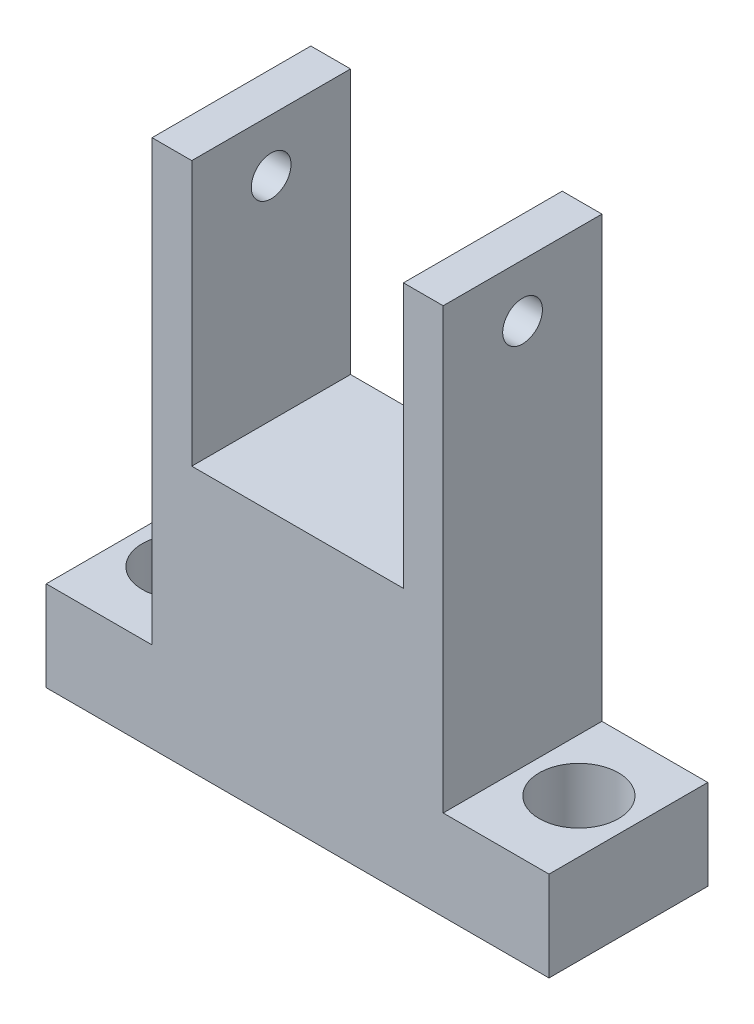
ISO-10303-21;
HEADER;
FILE_DESCRIPTION(('STEP AP214'),'2;1');
FILE_NAME('part.step','',(''),(''),'','','');
FILE_SCHEMA(('AUTOMOTIVE_DESIGN { 1 0 10303 214 1 1 1 1 }'));
ENDSEC;
DATA;
#1=APPLICATION_CONTEXT('core data for automotive mechanical design processes');
#2=APPLICATION_PROTOCOL_DEFINITION('international standard','automotive_design',2000,#1);
#3=PRODUCT_CONTEXT('',#1,'mechanical');
#4=PRODUCT('Part','Part','',(#3));
#5=PRODUCT_RELATED_PRODUCT_CATEGORY('part','',(#4));
#6=PRODUCT_DEFINITION_FORMATION('','',#4);
#7=PRODUCT_DEFINITION_CONTEXT('part definition',#1,'design');
#8=PRODUCT_DEFINITION('design','',#6,#7);
#9=PRODUCT_DEFINITION_SHAPE('','',#8);
#10=(LENGTH_UNIT() NAMED_UNIT(*) SI_UNIT(.MILLI.,.METRE.));
#11=(NAMED_UNIT(*) PLANE_ANGLE_UNIT() SI_UNIT($,.RADIAN.));
#12=(NAMED_UNIT(*) SI_UNIT($,.STERADIAN.) SOLID_ANGLE_UNIT());
#13=UNCERTAINTY_MEASURE_WITH_UNIT(LENGTH_MEASURE(1.E-05),#10,'distance_accuracy_value','');
#14=(GEOMETRIC_REPRESENTATION_CONTEXT(3) GLOBAL_UNCERTAINTY_ASSIGNED_CONTEXT((#13)) GLOBAL_UNIT_ASSIGNED_CONTEXT((#10,
#11,#12)) REPRESENTATION_CONTEXT('',''));
#15=CARTESIAN_POINT('',(0.,0.,0.));
#16=DIRECTION('',(0.,0.,1.));
#17=DIRECTION('',(1.,0.,0.));
#18=AXIS2_PLACEMENT_3D('',#15,#16,#17);
#19=CARTESIAN_POINT('',(0.,3.4,0.));
#20=DIRECTION('',(0.,1.,0.));
#21=DIRECTION('',(0.,0.,1.));
#22=AXIS2_PLACEMENT_3D('',#19,#20,#21);
#23=PLANE('',#22);
#24=CARTESIAN_POINT('',(-7.5,3.4,-0.128979829095297));
#25=DIRECTION('',(0.,1.,0.));
#26=DIRECTION('',(0.,0.,1.));
#27=AXIS2_PLACEMENT_3D('',#24,#25,#26);
#28=CIRCLE('',#27,1.5);
#29=CARTESIAN_POINT('',(-7.5,3.4,1.3710201709047));
#30=VERTEX_POINT('',#29);
#31=EDGE_CURVE('E177',#30,#30,#28,.T.);
#32=ORIENTED_EDGE('',*,*,#31,.F.);
#33=EDGE_LOOP('',(#32));
#34=FACE_BOUND('',#33,.T.);
#35=DIRECTION('',(1.,0.,0.));
#36=VECTOR('',#35,1.);
#37=CARTESIAN_POINT('',(0.,3.4,3.));
#38=LINE('',#37,#36);
#39=CARTESIAN_POINT('',(-9.5,3.4,3.));
#40=VERTEX_POINT('',#39);
#41=CARTESIAN_POINT('',(-5.5,3.4,3.));
#42=VERTEX_POINT('',#41);
#43=EDGE_CURVE('E185',#40,#42,#38,.T.);
#44=ORIENTED_EDGE('',*,*,#43,.T.);
#45=DIRECTION('',(0.,0.,-1.));
#46=VECTOR('',#45,1.);
#47=CARTESIAN_POINT('',(-5.5,3.4,0.));
#48=LINE('',#47,#46);
#49=CARTESIAN_POINT('',(-5.5,3.4,-3.));
#50=VERTEX_POINT('',#49);
#51=EDGE_CURVE('E174',#42,#50,#48,.T.);
#52=ORIENTED_EDGE('',*,*,#51,.T.);
#53=DIRECTION('',(1.,0.,0.));
#54=VECTOR('',#53,1.);
#55=CARTESIAN_POINT('',(0.,3.4,-3.));
#56=LINE('',#55,#54);
#57=CARTESIAN_POINT('',(-9.5,3.4,-3.));
#58=VERTEX_POINT('',#57);
#59=EDGE_CURVE('E191',#58,#50,#56,.T.);
#60=ORIENTED_EDGE('',*,*,#59,.F.);
#61=DIRECTION('',(0.,0.,1.));
#62=VECTOR('',#61,1.);
#63=CARTESIAN_POINT('',(-9.5,3.4,0.));
#64=LINE('',#63,#62);
#65=EDGE_CURVE('E180',#58,#40,#64,.T.);
#66=ORIENTED_EDGE('',*,*,#65,.T.);
#67=EDGE_LOOP('',(#44,#52,#60,#66));
#68=FACE_BOUND('',#67,.T.);
#69=ADVANCED_FACE('F37',(#34,#68),#23,.T.);
#70=CARTESIAN_POINT('',(-9.5,3.4,0.));
#71=DIRECTION('',(1.,0.,0.));
#72=DIRECTION('',(0.,0.,-1.));
#73=AXIS2_PLACEMENT_3D('',#70,#71,#72);
#74=PLANE('',#73);
#75=DIRECTION('',(0.,0.,1.));
#76=VECTOR('',#75,1.);
#77=CARTESIAN_POINT('',(-9.5,0.,0.));
#78=LINE('',#77,#76);
#79=CARTESIAN_POINT('',(-9.5,0.,-3.));
#80=VERTEX_POINT('',#79);
#81=CARTESIAN_POINT('',(-9.5,0.,3.));
#82=VERTEX_POINT('',#81);
#83=EDGE_CURVE('E200',#80,#82,#78,.T.);
#84=ORIENTED_EDGE('',*,*,#83,.T.);
#85=DIRECTION('',(0.,-1.,0.));
#86=VECTOR('',#85,1.);
#87=CARTESIAN_POINT('',(-9.5,3.4,3.));
#88=LINE('',#87,#86);
#89=EDGE_CURVE('E11',#40,#82,#88,.T.);
#90=ORIENTED_EDGE('',*,*,#89,.F.);
#91=ORIENTED_EDGE('',*,*,#65,.F.);
#92=DIRECTION('',(0.,-1.,0.));
#93=VECTOR('',#92,1.);
#94=CARTESIAN_POINT('',(-9.5,3.4,-3.));
#95=LINE('',#94,#93);
#96=EDGE_CURVE('E197',#58,#80,#95,.T.);
#97=ORIENTED_EDGE('',*,*,#96,.T.);
#98=EDGE_LOOP('',(#84,#90,#91,#97));
#99=FACE_BOUND('',#98,.T.);
#100=ADVANCED_FACE('F278',(#99),#74,.F.);
#101=CARTESIAN_POINT('',(0.,3.4,3.));
#102=DIRECTION('',(0.,0.,-1.));
#103=DIRECTION('',(-1.,0.,0.));
#104=AXIS2_PLACEMENT_3D('',#101,#102,#103);
#105=PLANE('',#104);
#106=DIRECTION('',(1.,0.,0.));
#107=VECTOR('',#106,1.);
#108=CARTESIAN_POINT('',(0.,0.,3.));
#109=LINE('',#108,#107);
#110=CARTESIAN_POINT('',(9.5,0.,3.));
#111=VERTEX_POINT('',#110);
#112=EDGE_CURVE('E203',#82,#111,#109,.T.);
#113=ORIENTED_EDGE('',*,*,#112,.T.);
#114=DIRECTION('',(0.,-1.,0.));
#115=VECTOR('',#114,1.);
#116=CARTESIAN_POINT('',(9.5,3.4,3.));
#117=LINE('',#116,#115);
#118=CARTESIAN_POINT('',(9.5,3.4,3.));
#119=VERTEX_POINT('',#118);
#120=EDGE_CURVE('E46',#119,#111,#117,.T.);
#121=ORIENTED_EDGE('',*,*,#120,.F.);
#122=CARTESIAN_POINT('',(5.5,3.4,3.));
#123=VERTEX_POINT('',#122);
#124=EDGE_CURVE('E184',#123,#119,#38,.T.);
#125=ORIENTED_EDGE('',*,*,#124,.F.);
#126=DIRECTION('',(0.,-1.,0.));
#127=VECTOR('',#126,1.);
#128=CARTESIAN_POINT('',(5.5,20.,3.));
#129=LINE('',#128,#127);
#130=CARTESIAN_POINT('',(5.5,20.,3.));
#131=VERTEX_POINT('',#130);
#132=EDGE_CURVE('E152',#131,#123,#129,.T.);
#133=ORIENTED_EDGE('',*,*,#132,.F.);
#134=DIRECTION('',(1.,0.,0.));
#135=VECTOR('',#134,1.);
#136=CARTESIAN_POINT('',(0.,20.,3.));
#137=LINE('',#136,#135);
#138=CARTESIAN_POINT('',(4.,20.,3.));
#139=VERTEX_POINT('',#138);
#140=EDGE_CURVE('E244',#139,#131,#137,.T.);
#141=ORIENTED_EDGE('',*,*,#140,.F.);
#142=DIRECTION('',(0.,-1.,0.));
#143=VECTOR('',#142,1.);
#144=CARTESIAN_POINT('',(4.,20.,3.));
#145=LINE('',#144,#143);
#146=CARTESIAN_POINT('',(4.,10.,3.));
#147=VERTEX_POINT('',#146);
#148=EDGE_CURVE('E148',#139,#147,#145,.T.);
#149=ORIENTED_EDGE('',*,*,#148,.T.);
#150=DIRECTION('',(1.,0.,0.));
#151=VECTOR('',#150,1.);
#152=CARTESIAN_POINT('',(0.,10.,3.));
#153=LINE('',#152,#151);
#154=CARTESIAN_POINT('',(-4.,10.,3.));
#155=VERTEX_POINT('',#154);
#156=EDGE_CURVE('E53',#155,#147,#153,.T.);
#157=ORIENTED_EDGE('',*,*,#156,.F.);
#158=DIRECTION('',(0.,-1.,0.));
#159=VECTOR('',#158,1.);
#160=CARTESIAN_POINT('',(-4.,20.,3.));
#161=LINE('',#160,#159);
#162=CARTESIAN_POINT('',(-4.,20.,3.));
#163=VERTEX_POINT('',#162);
#164=EDGE_CURVE('E164',#163,#155,#161,.T.);
#165=ORIENTED_EDGE('',*,*,#164,.F.);
#166=DIRECTION('',(1.,0.,0.));
#167=VECTOR('',#166,1.);
#168=CARTESIAN_POINT('',(0.,20.,3.));
#169=LINE('',#168,#167);
#170=CARTESIAN_POINT('',(-5.5,20.,3.));
#171=VERTEX_POINT('',#170);
#172=EDGE_CURVE('E162',#171,#163,#169,.T.);
#173=ORIENTED_EDGE('',*,*,#172,.F.);
#174=DIRECTION('',(0.,-1.,0.));
#175=VECTOR('',#174,1.);
#176=CARTESIAN_POINT('',(-5.5,20.,3.));
#177=LINE('',#176,#175);
#178=EDGE_CURVE('E167',#171,#42,#177,.T.);
#179=ORIENTED_EDGE('',*,*,#178,.T.);
#180=ORIENTED_EDGE('',*,*,#43,.F.);
#181=ORIENTED_EDGE('',*,*,#89,.T.);
#182=EDGE_LOOP('',(#113,#121,#125,#133,#141,#149,#157,#165,#173,#179,#180,#181));
#183=FACE_BOUND('',#182,.T.);
#184=ADVANCED_FACE('F233',(#183),#105,.F.);
#185=CARTESIAN_POINT('',(9.5,3.4,0.));
#186=DIRECTION('',(1.,0.,0.));
#187=DIRECTION('',(0.,0.,-1.));
#188=AXIS2_PLACEMENT_3D('',#185,#186,#187);
#189=PLANE('',#188);
#190=DIRECTION('',(0.,0.,1.));
#191=VECTOR('',#190,1.);
#192=CARTESIAN_POINT('',(9.5,0.,0.));
#193=LINE('',#192,#191);
#194=CARTESIAN_POINT('',(9.5,0.,-3.));
#195=VERTEX_POINT('',#194);
#196=EDGE_CURVE('E205',#195,#111,#193,.T.);
#197=ORIENTED_EDGE('',*,*,#196,.F.);
#198=DIRECTION('',(0.,-1.,0.));
#199=VECTOR('',#198,1.);
#200=CARTESIAN_POINT('',(9.5,3.4,-3.));
#201=LINE('',#200,#199);
#202=CARTESIAN_POINT('',(9.5,3.4,-3.));
#203=VERTEX_POINT('',#202);
#204=EDGE_CURVE('E213',#203,#195,#201,.T.);
#205=ORIENTED_EDGE('',*,*,#204,.F.);
#206=DIRECTION('',(0.,0.,1.));
#207=VECTOR('',#206,1.);
#208=CARTESIAN_POINT('',(9.5,3.4,0.));
#209=LINE('',#208,#207);
#210=EDGE_CURVE('E187',#203,#119,#209,.T.);
#211=ORIENTED_EDGE('',*,*,#210,.T.);
#212=ORIENTED_EDGE('',*,*,#120,.T.);
#213=EDGE_LOOP('',(#197,#205,#211,#212));
#214=FACE_BOUND('',#213,.T.);
#215=ADVANCED_FACE('F219',(#214),#189,.T.);
#216=CARTESIAN_POINT('',(0.,3.4,-3.));
#217=DIRECTION('',(0.,0.,-1.));
#218=DIRECTION('',(-1.,0.,0.));
#219=AXIS2_PLACEMENT_3D('',#216,#217,#218);
#220=PLANE('',#219);
#221=ORIENTED_EDGE('',*,*,#204,.T.);
#222=DIRECTION('',(1.,0.,0.));
#223=VECTOR('',#222,1.);
#224=CARTESIAN_POINT('',(0.,0.,-3.));
#225=LINE('',#224,#223);
#226=EDGE_CURVE('E208',#80,#195,#225,.T.);
#227=ORIENTED_EDGE('',*,*,#226,.F.);
#228=ORIENTED_EDGE('',*,*,#96,.F.);
#229=ORIENTED_EDGE('',*,*,#59,.T.);
#230=DIRECTION('',(0.,-1.,0.));
#231=VECTOR('',#230,1.);
#232=CARTESIAN_POINT('',(-5.5,20.,-3.));
#233=LINE('',#232,#231);
#234=CARTESIAN_POINT('',(-5.5,20.,-3.));
#235=VERTEX_POINT('',#234);
#236=EDGE_CURVE('E170',#235,#50,#233,.T.);
#237=ORIENTED_EDGE('',*,*,#236,.F.);
#238=DIRECTION('',(1.,0.,0.));
#239=VECTOR('',#238,1.);
#240=CARTESIAN_POINT('',(0.,20.,-3.));
#241=LINE('',#240,#239);
#242=CARTESIAN_POINT('',(-4.,20.,-3.));
#243=VERTEX_POINT('',#242);
#244=EDGE_CURVE('E158',#235,#243,#241,.T.);
#245=ORIENTED_EDGE('',*,*,#244,.T.);
#246=DIRECTION('',(0.,-1.,0.));
#247=VECTOR('',#246,1.);
#248=CARTESIAN_POINT('',(-4.,20.,-3.));
#249=LINE('',#248,#247);
#250=CARTESIAN_POINT('',(-4.,10.,-3.));
#251=VERTEX_POINT('',#250);
#252=EDGE_CURVE('E142',#243,#251,#249,.T.);
#253=ORIENTED_EDGE('',*,*,#252,.T.);
#254=DIRECTION('',(1.,0.,0.));
#255=VECTOR('',#254,1.);
#256=CARTESIAN_POINT('',(0.,10.,-3.));
#257=LINE('',#256,#255);
#258=CARTESIAN_POINT('',(4.,10.,-3.));
#259=VERTEX_POINT('',#258);
#260=EDGE_CURVE('E127',#251,#259,#257,.T.);
#261=ORIENTED_EDGE('',*,*,#260,.T.);
#262=DIRECTION('',(0.,-1.,0.));
#263=VECTOR('',#262,1.);
#264=CARTESIAN_POINT('',(4.,20.,-3.));
#265=LINE('',#264,#263);
#266=CARTESIAN_POINT('',(4.,20.,-3.));
#267=VERTEX_POINT('',#266);
#268=EDGE_CURVE('E139',#267,#259,#265,.T.);
#269=ORIENTED_EDGE('',*,*,#268,.F.);
#270=DIRECTION('',(1.,0.,0.));
#271=VECTOR('',#270,1.);
#272=CARTESIAN_POINT('',(0.,20.,-3.));
#273=LINE('',#272,#271);
#274=CARTESIAN_POINT('',(5.5,20.,-3.));
#275=VERTEX_POINT('',#274);
#276=EDGE_CURVE('E247',#267,#275,#273,.T.);
#277=ORIENTED_EDGE('',*,*,#276,.T.);
#278=DIRECTION('',(0.,-1.,0.));
#279=VECTOR('',#278,1.);
#280=CARTESIAN_POINT('',(5.5,20.,-3.));
#281=LINE('',#280,#279);
#282=CARTESIAN_POINT('',(5.5,3.4,-3.));
#283=VERTEX_POINT('',#282);
#284=EDGE_CURVE('E240',#275,#283,#281,.T.);
#285=ORIENTED_EDGE('',*,*,#284,.T.);
#286=EDGE_CURVE('E190',#283,#203,#56,.T.);
#287=ORIENTED_EDGE('',*,*,#286,.T.);
#288=EDGE_LOOP('',(#221,#227,#228,#229,#237,#245,#253,#261,#269,#277,#285,#287));
#289=FACE_BOUND('',#288,.T.);
#290=ADVANCED_FACE('F137',(#289),#220,.T.);
#291=CARTESIAN_POINT('',(-7.5,3.4,-0.128979829095297));
#292=DIRECTION('',(0.,-1.,0.));
#293=DIRECTION('',(0.,0.,-1.));
#294=AXIS2_PLACEMENT_3D('',#291,#292,#293);
#295=CYLINDRICAL_SURFACE('',#294,1.5);
#296=ORIENTED_EDGE('',*,*,#31,.T.);
#297=EDGE_LOOP('',(#296));
#298=FACE_BOUND('',#297,.T.);
#299=CARTESIAN_POINT('',(-7.5,0.,-0.128979829095297));
#300=DIRECTION('',(0.,1.,0.));
#301=DIRECTION('',(0.,0.,1.));
#302=AXIS2_PLACEMENT_3D('',#299,#300,#301);
#303=CIRCLE('',#302,1.5);
#304=CARTESIAN_POINT('',(-7.5,0.,1.3710201709047));
#305=VERTEX_POINT('',#304);
#306=EDGE_CURVE('E176',#305,#305,#303,.T.);
#307=ORIENTED_EDGE('',*,*,#306,.F.);
#308=EDGE_LOOP('',(#307));
#309=FACE_BOUND('',#308,.T.);
#310=ADVANCED_FACE('F39',(#298,#309),#295,.F.);
#311=CARTESIAN_POINT('',(7.5,3.4,-0.128979829095297));
#312=DIRECTION('',(0.,-1.,0.));
#313=DIRECTION('',(0.,0.,-1.));
#314=AXIS2_PLACEMENT_3D('',#311,#312,#313);
#315=CYLINDRICAL_SURFACE('',#314,1.5);
#316=CARTESIAN_POINT('',(7.5,3.4,-0.128979829095297));
#317=DIRECTION('',(0.,1.,0.));
#318=DIRECTION('',(0.,0.,1.));
#319=AXIS2_PLACEMENT_3D('',#316,#317,#318);
#320=CIRCLE('',#319,1.5);
#321=CARTESIAN_POINT('',(7.5,3.4,1.3710201709047));
#322=VERTEX_POINT('',#321);
#323=EDGE_CURVE('E194',#322,#322,#320,.F.);
#324=ORIENTED_EDGE('',*,*,#323,.F.);
#325=EDGE_LOOP('',(#324));
#326=FACE_BOUND('',#325,.T.);
#327=CARTESIAN_POINT('',(7.5,0.,-0.128979829095297));
#328=DIRECTION('',(0.,1.,0.));
#329=DIRECTION('',(0.,0.,1.));
#330=AXIS2_PLACEMENT_3D('',#327,#328,#329);
#331=CIRCLE('',#330,1.5);
#332=CARTESIAN_POINT('',(7.5,0.,1.3710201709047));
#333=VERTEX_POINT('',#332);
#334=EDGE_CURVE('E181',#333,#333,#331,.F.);
#335=ORIENTED_EDGE('',*,*,#334,.T.);
#336=EDGE_LOOP('',(#335));
#337=FACE_BOUND('',#336,.T.);
#338=ADVANCED_FACE('F290',(#326,#337),#315,.F.);
#339=DIRECTION('',(0.,0.,-1.));
#340=VECTOR('',#339,1.);
#341=CARTESIAN_POINT('',(5.5,3.4,0.));
#342=LINE('',#341,#340);
#343=EDGE_CURVE('E61',#123,#283,#342,.T.);
#344=ORIENTED_EDGE('',*,*,#343,.F.);
#345=ORIENTED_EDGE('',*,*,#124,.T.);
#346=ORIENTED_EDGE('',*,*,#210,.F.);
#347=ORIENTED_EDGE('',*,*,#286,.F.);
#348=EDGE_LOOP('',(#344,#345,#346,#347));
#349=FACE_BOUND('',#348,.T.);
#350=ORIENTED_EDGE('',*,*,#323,.T.);
#351=EDGE_LOOP('',(#350));
#352=FACE_BOUND('',#351,.T.);
#353=ADVANCED_FACE('F229',(#349,#352),#23,.T.);
#354=CARTESIAN_POINT('',(0.,0.,0.));
#355=DIRECTION('',(0.,1.,0.));
#356=DIRECTION('',(0.,0.,1.));
#357=AXIS2_PLACEMENT_3D('',#354,#355,#356);
#358=PLANE('',#357);
#359=ORIENTED_EDGE('',*,*,#196,.T.);
#360=ORIENTED_EDGE('',*,*,#112,.F.);
#361=ORIENTED_EDGE('',*,*,#83,.F.);
#362=ORIENTED_EDGE('',*,*,#226,.T.);
#363=EDGE_LOOP('',(#359,#360,#361,#362));
#364=FACE_BOUND('',#363,.T.);
#365=ORIENTED_EDGE('',*,*,#334,.F.);
#366=EDGE_LOOP('',(#365));
#367=FACE_BOUND('',#366,.T.);
#368=ORIENTED_EDGE('',*,*,#306,.T.);
#369=EDGE_LOOP('',(#368));
#370=FACE_BOUND('',#369,.T.);
#371=ADVANCED_FACE('F224',(#364,#367,#370),#358,.F.);
#372=CARTESIAN_POINT('',(-4.,20.,0.));
#373=DIRECTION('',(1.,0.,0.));
#374=DIRECTION('',(0.,0.,-1.));
#375=AXIS2_PLACEMENT_3D('',#372,#373,#374);
#376=PLANE('',#375);
#377=DIRECTION('',(0.,0.,1.));
#378=VECTOR('',#377,1.);
#379=CARTESIAN_POINT('',(-4.,10.,0.));
#380=LINE('',#379,#378);
#381=EDGE_CURVE('E143',#251,#155,#380,.T.);
#382=ORIENTED_EDGE('',*,*,#381,.F.);
#383=ORIENTED_EDGE('',*,*,#252,.F.);
#384=DIRECTION('',(0.,0.,1.));
#385=VECTOR('',#384,1.);
#386=CARTESIAN_POINT('',(-4.,20.,0.));
#387=LINE('',#386,#385);
#388=EDGE_CURVE('E150',#243,#163,#387,.T.);
#389=ORIENTED_EDGE('',*,*,#388,.T.);
#390=ORIENTED_EDGE('',*,*,#164,.T.);
#391=EDGE_LOOP('',(#382,#383,#389,#390));
#392=FACE_BOUND('',#391,.T.);
#393=CARTESIAN_POINT('',(-4.,18.,0.));
#394=DIRECTION('',(1.,0.,0.));
#395=DIRECTION('',(0.,0.,-1.));
#396=AXIS2_PLACEMENT_3D('',#393,#394,#395);
#397=CIRCLE('',#396,0.750000000000001);
#398=CARTESIAN_POINT('',(-4.,18.,-0.750000000000001));
#399=VERTEX_POINT('',#398);
#400=EDGE_CURVE('E249',#399,#399,#397,.T.);
#401=ORIENTED_EDGE('',*,*,#400,.F.);
#402=EDGE_LOOP('',(#401));
#403=FACE_BOUND('',#402,.T.);
#404=ADVANCED_FACE('F295',(#392,#403),#376,.T.);
#405=CARTESIAN_POINT('',(-5.5,20.,0.));
#406=DIRECTION('',(1.,0.,0.));
#407=DIRECTION('',(0.,0.,-1.));
#408=AXIS2_PLACEMENT_3D('',#405,#406,#407);
#409=PLANE('',#408);
#410=CARTESIAN_POINT('',(-5.5,18.,0.));
#411=DIRECTION('',(1.,0.,0.));
#412=DIRECTION('',(0.,0.,-1.));
#413=AXIS2_PLACEMENT_3D('',#410,#411,#412);
#414=CIRCLE('',#413,0.750000000000001);
#415=CARTESIAN_POINT('',(-5.5,18.,-0.750000000000001));
#416=VERTEX_POINT('',#415);
#417=EDGE_CURVE('E252',#416,#416,#414,.T.);
#418=ORIENTED_EDGE('',*,*,#417,.T.);
#419=EDGE_LOOP('',(#418));
#420=FACE_BOUND('',#419,.T.);
#421=ORIENTED_EDGE('',*,*,#51,.F.);
#422=ORIENTED_EDGE('',*,*,#178,.F.);
#423=DIRECTION('',(0.,0.,1.));
#424=VECTOR('',#423,1.);
#425=CARTESIAN_POINT('',(-5.5,20.,0.));
#426=LINE('',#425,#424);
#427=EDGE_CURVE('E160',#235,#171,#426,.T.);
#428=ORIENTED_EDGE('',*,*,#427,.F.);
#429=ORIENTED_EDGE('',*,*,#236,.T.);
#430=EDGE_LOOP('',(#421,#422,#428,#429));
#431=FACE_BOUND('',#430,.T.);
#432=ADVANCED_FACE('F355',(#420,#431),#409,.F.);
#433=CARTESIAN_POINT('',(0.,20.,0.));
#434=DIRECTION('',(0.,1.,0.));
#435=DIRECTION('',(0.,0.,1.));
#436=AXIS2_PLACEMENT_3D('',#433,#434,#435);
#437=PLANE('',#436);
#438=ORIENTED_EDGE('',*,*,#388,.F.);
#439=ORIENTED_EDGE('',*,*,#244,.F.);
#440=ORIENTED_EDGE('',*,*,#427,.T.);
#441=ORIENTED_EDGE('',*,*,#172,.T.);
#442=EDGE_LOOP('',(#438,#439,#440,#441));
#443=FACE_BOUND('',#442,.T.);
#444=ADVANCED_FACE('F274',(#443),#437,.T.);
#445=CARTESIAN_POINT('',(4.,20.,0.));
#446=DIRECTION('',(1.,0.,0.));
#447=DIRECTION('',(0.,0.,-1.));
#448=AXIS2_PLACEMENT_3D('',#445,#446,#447);
#449=PLANE('',#448);
#450=CARTESIAN_POINT('',(4.,18.,0.));
#451=DIRECTION('',(1.,0.,0.));
#452=DIRECTION('',(0.,0.,-1.));
#453=AXIS2_PLACEMENT_3D('',#450,#451,#452);
#454=CIRCLE('',#453,0.750000000000001);
#455=CARTESIAN_POINT('',(4.,18.,-0.750000000000001));
#456=VERTEX_POINT('',#455);
#457=EDGE_CURVE('E255',#456,#456,#454,.T.);
#458=ORIENTED_EDGE('',*,*,#457,.T.);
#459=EDGE_LOOP('',(#458));
#460=FACE_BOUND('',#459,.T.);
#461=ORIENTED_EDGE('',*,*,#268,.T.);
#462=DIRECTION('',(0.,0.,1.));
#463=VECTOR('',#462,1.);
#464=CARTESIAN_POINT('',(4.,10.,0.));
#465=LINE('',#464,#463);
#466=EDGE_CURVE('E124',#259,#147,#465,.T.);
#467=ORIENTED_EDGE('',*,*,#466,.T.);
#468=ORIENTED_EDGE('',*,*,#148,.F.);
#469=DIRECTION('',(0.,0.,1.));
#470=VECTOR('',#469,1.);
#471=CARTESIAN_POINT('',(4.,20.,0.));
#472=LINE('',#471,#470);
#473=EDGE_CURVE('E146',#267,#139,#472,.T.);
#474=ORIENTED_EDGE('',*,*,#473,.F.);
#475=EDGE_LOOP('',(#461,#467,#468,#474));
#476=FACE_BOUND('',#475,.T.);
#477=ADVANCED_FACE('F145',(#460,#476),#449,.F.);
#478=CARTESIAN_POINT('',(5.5,20.,0.));
#479=DIRECTION('',(1.,0.,0.));
#480=DIRECTION('',(0.,0.,-1.));
#481=AXIS2_PLACEMENT_3D('',#478,#479,#480);
#482=PLANE('',#481);
#483=CARTESIAN_POINT('',(5.5,18.,0.));
#484=DIRECTION('',(1.,0.,0.));
#485=DIRECTION('',(0.,0.,-1.));
#486=AXIS2_PLACEMENT_3D('',#483,#484,#485);
#487=CIRCLE('',#486,0.750000000000001);
#488=CARTESIAN_POINT('',(5.5,18.,-0.750000000000001));
#489=VERTEX_POINT('',#488);
#490=EDGE_CURVE('E41',#489,#489,#487,.T.);
#491=ORIENTED_EDGE('',*,*,#490,.F.);
#492=EDGE_LOOP('',(#491));
#493=FACE_BOUND('',#492,.T.);
#494=ORIENTED_EDGE('',*,*,#132,.T.);
#495=ORIENTED_EDGE('',*,*,#343,.T.);
#496=ORIENTED_EDGE('',*,*,#284,.F.);
#497=DIRECTION('',(0.,0.,1.));
#498=VECTOR('',#497,1.);
#499=CARTESIAN_POINT('',(5.5,20.,0.));
#500=LINE('',#499,#498);
#501=EDGE_CURVE('E239',#275,#131,#500,.T.);
#502=ORIENTED_EDGE('',*,*,#501,.T.);
#503=EDGE_LOOP('',(#494,#495,#496,#502));
#504=FACE_BOUND('',#503,.T.);
#505=ADVANCED_FACE('F237',(#493,#504),#482,.T.);
#506=CARTESIAN_POINT('',(0.,20.,0.));
#507=DIRECTION('',(0.,1.,0.));
#508=DIRECTION('',(0.,0.,1.));
#509=AXIS2_PLACEMENT_3D('',#506,#507,#508);
#510=PLANE('',#509);
#511=ORIENTED_EDGE('',*,*,#276,.F.);
#512=ORIENTED_EDGE('',*,*,#473,.T.);
#513=ORIENTED_EDGE('',*,*,#140,.T.);
#514=ORIENTED_EDGE('',*,*,#501,.F.);
#515=EDGE_LOOP('',(#511,#512,#513,#514));
#516=FACE_BOUND('',#515,.T.);
#517=ADVANCED_FACE('F266',(#516),#510,.T.);
#518=CARTESIAN_POINT('',(-9.5,18.,0.));
#519=DIRECTION('',(1.,0.,0.));
#520=DIRECTION('',(0.,0.,-1.));
#521=AXIS2_PLACEMENT_3D('',#518,#519,#520);
#522=CYLINDRICAL_SURFACE('',#521,0.750000000000001);
#523=ORIENTED_EDGE('',*,*,#490,.T.);
#524=EDGE_LOOP('',(#523));
#525=FACE_BOUND('',#524,.T.);
#526=ORIENTED_EDGE('',*,*,#457,.F.);
#527=EDGE_LOOP('',(#526));
#528=FACE_BOUND('',#527,.T.);
#529=ADVANCED_FACE('F262',(#525,#528),#522,.F.);
#530=ORIENTED_EDGE('',*,*,#400,.T.);
#531=EDGE_LOOP('',(#530));
#532=FACE_BOUND('',#531,.T.);
#533=ORIENTED_EDGE('',*,*,#417,.F.);
#534=EDGE_LOOP('',(#533));
#535=FACE_BOUND('',#534,.T.);
#536=ADVANCED_FACE('F386',(#532,#535),#522,.F.);
#537=CARTESIAN_POINT('',(0.,10.,0.));
#538=DIRECTION('',(0.,1.,0.));
#539=DIRECTION('',(0.,0.,1.));
#540=AXIS2_PLACEMENT_3D('',#537,#538,#539);
#541=PLANE('',#540);
#542=ORIENTED_EDGE('',*,*,#156,.T.);
#543=ORIENTED_EDGE('',*,*,#466,.F.);
#544=ORIENTED_EDGE('',*,*,#260,.F.);
#545=ORIENTED_EDGE('',*,*,#381,.T.);
#546=EDGE_LOOP('',(#542,#543,#544,#545));
#547=FACE_BOUND('',#546,.T.);
#548=ADVANCED_FACE('F126',(#547),#541,.T.);
#549=CLOSED_SHELL('',(#69,#100,#184,#215,#290,#310,#338,#353,#371,#404,#432,#444,#477,#505,#517,
#529,#536,#548));
#550=MANIFOLD_SOLID_BREP('B2',#549);
#551=ADVANCED_BREP_SHAPE_REPRESENTATION('',(#18,#550),#14);
#552=SHAPE_DEFINITION_REPRESENTATION(#9,#551);
ENDSEC;
END-ISO-10303-21;
